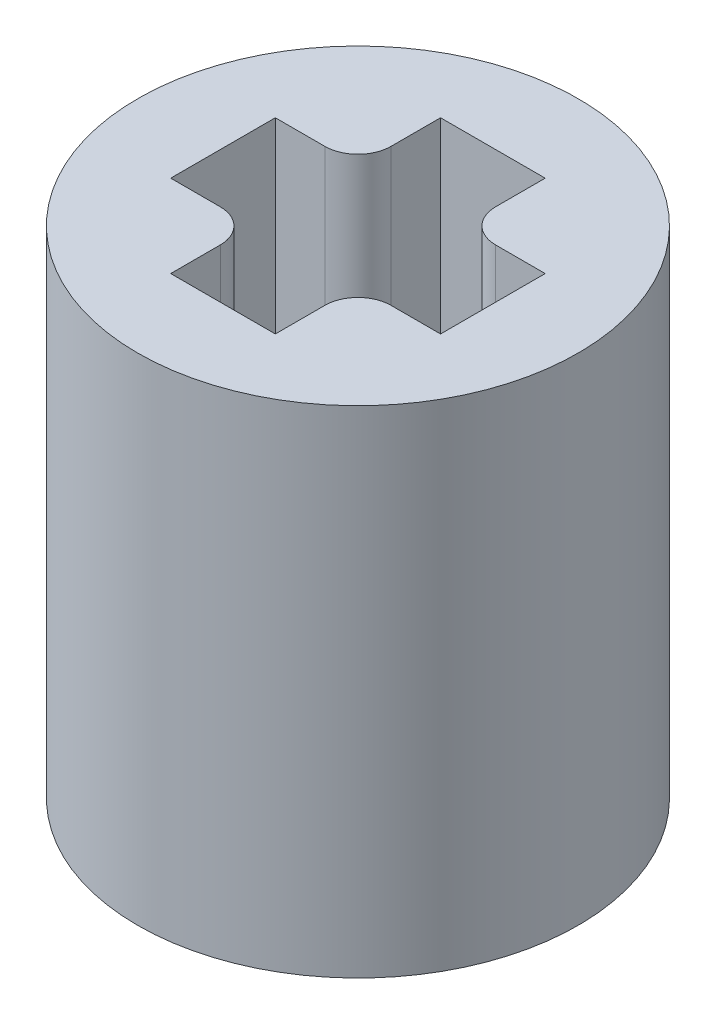
ISO-10303-21;
HEADER;
FILE_DESCRIPTION(('STEP AP214'),'2;1');
FILE_NAME('part.step','',(''),(''),'','','');
FILE_SCHEMA(('AUTOMOTIVE_DESIGN { 1 0 10303 214 1 1 1 1 }'));
ENDSEC;
DATA;
#1=APPLICATION_CONTEXT('core data for automotive mechanical design processes');
#2=APPLICATION_PROTOCOL_DEFINITION('international standard','automotive_design',2000,#1);
#3=PRODUCT_CONTEXT('',#1,'mechanical');
#4=PRODUCT('Part','Part','',(#3));
#5=PRODUCT_RELATED_PRODUCT_CATEGORY('part','',(#4));
#6=PRODUCT_DEFINITION_FORMATION('','',#4);
#7=PRODUCT_DEFINITION_CONTEXT('part definition',#1,'design');
#8=PRODUCT_DEFINITION('design','',#6,#7);
#9=PRODUCT_DEFINITION_SHAPE('','',#8);
#10=(LENGTH_UNIT() NAMED_UNIT(*) SI_UNIT(.MILLI.,.METRE.));
#11=(NAMED_UNIT(*) PLANE_ANGLE_UNIT() SI_UNIT($,.RADIAN.));
#12=(NAMED_UNIT(*) SI_UNIT($,.STERADIAN.) SOLID_ANGLE_UNIT());
#13=UNCERTAINTY_MEASURE_WITH_UNIT(LENGTH_MEASURE(1.E-05),#10,'distance_accuracy_value','');
#14=(GEOMETRIC_REPRESENTATION_CONTEXT(3) GLOBAL_UNCERTAINTY_ASSIGNED_CONTEXT((#13)) GLOBAL_UNIT_ASSIGNED_CONTEXT((#10,
#11,#12)) REPRESENTATION_CONTEXT('',''));
#15=CARTESIAN_POINT('',(0.,0.,0.));
#16=DIRECTION('',(0.,0.,1.));
#17=DIRECTION('',(1.,0.,0.));
#18=AXIS2_PLACEMENT_3D('',#15,#16,#17);
#19=CARTESIAN_POINT('',(0.,0.,0.));
#20=DIRECTION('',(0.,1.,0.));
#21=DIRECTION('',(0.,0.,1.));
#22=AXIS2_PLACEMENT_3D('',#19,#20,#21);
#23=PLANE('',#22);
#24=CARTESIAN_POINT('',(0.,0.,0.));
#25=DIRECTION('',(0.,1.,0.));
#26=DIRECTION('',(0.,0.,1.));
#27=AXIS2_PLACEMENT_3D('',#24,#25,#26);
#28=CIRCLE('',#27,4.);
#29=CARTESIAN_POINT('',(0.,0.,4.));
#30=VERTEX_POINT('',#29);
#31=EDGE_CURVE('E248',#30,#30,#28,.T.);
#32=ORIENTED_EDGE('',*,*,#31,.F.);
#33=EDGE_LOOP('',(#32));
#34=FACE_BOUND('',#33,.T.);
#35=CARTESIAN_POINT('',(0.,0.,0.));
#36=DIRECTION('',(0.,1.,0.));
#37=DIRECTION('',(0.,0.,1.));
#38=AXIS2_PLACEMENT_3D('',#35,#36,#37);
#39=CIRCLE('',#38,2.5);
#40=CARTESIAN_POINT('',(0.,0.,2.5));
#41=VERTEX_POINT('',#40);
#42=EDGE_CURVE('E245',#41,#41,#39,.T.);
#43=ORIENTED_EDGE('',*,*,#42,.T.);
#44=EDGE_LOOP('',(#43));
#45=FACE_BOUND('',#44,.T.);
#46=ADVANCED_FACE('F33',(#34,#45),#23,.F.);
#47=CARTESIAN_POINT('',(0.,4.,0.));
#48=DIRECTION('',(0.,-1.,0.));
#49=DIRECTION('',(0.,0.,-1.));
#50=AXIS2_PLACEMENT_3D('',#47,#48,#49);
#51=CYLINDRICAL_SURFACE('',#50,4.);
#52=ORIENTED_EDGE('',*,*,#31,.T.);
#53=EDGE_LOOP('',(#52));
#54=FACE_BOUND('',#53,.T.);
#55=CARTESIAN_POINT('',(0.,9.,0.));
#56=DIRECTION('',(0.,1.,0.));
#57=DIRECTION('',(0.,0.,1.));
#58=AXIS2_PLACEMENT_3D('',#55,#56,#57);
#59=CIRCLE('',#58,4.);
#60=CARTESIAN_POINT('',(0.,9.,4.));
#61=VERTEX_POINT('',#60);
#62=EDGE_CURVE('E224',#61,#61,#59,.T.);
#63=ORIENTED_EDGE('',*,*,#62,.F.);
#64=EDGE_LOOP('',(#63));
#65=FACE_BOUND('',#64,.T.);
#66=ADVANCED_FACE('F323',(#54,#65),#51,.T.);
#67=CARTESIAN_POINT('',(0.,4.,0.));
#68=DIRECTION('',(0.,-1.,0.));
#69=DIRECTION('',(0.,0.,-1.));
#70=AXIS2_PLACEMENT_3D('',#67,#68,#69);
#71=CYLINDRICAL_SURFACE('',#70,2.5);
#72=CARTESIAN_POINT('',(0.,4.,0.));
#73=DIRECTION('',(0.,1.,0.));
#74=DIRECTION('',(0.,0.,1.));
#75=AXIS2_PLACEMENT_3D('',#72,#73,#74);
#76=CIRCLE('',#75,2.5);
#77=CARTESIAN_POINT('',(0.,4.,2.5));
#78=VERTEX_POINT('',#77);
#79=EDGE_CURVE('E242',#78,#78,#76,.T.);
#80=ORIENTED_EDGE('',*,*,#79,.T.);
#81=EDGE_LOOP('',(#80));
#82=FACE_BOUND('',#81,.T.);
#83=ORIENTED_EDGE('',*,*,#42,.F.);
#84=EDGE_LOOP('',(#83));
#85=FACE_BOUND('',#84,.T.);
#86=ADVANCED_FACE('F329',(#82,#85),#71,.F.);
#87=CARTESIAN_POINT('',(0.,4.,0.));
#88=DIRECTION('',(0.,1.,0.));
#89=DIRECTION('',(0.,0.,1.));
#90=AXIS2_PLACEMENT_3D('',#87,#88,#89);
#91=PLANE('',#90);
#92=ORIENTED_EDGE('',*,*,#79,.F.);
#93=EDGE_LOOP('',(#92));
#94=FACE_BOUND('',#93,.T.);
#95=ADVANCED_FACE('F336',(#94),#91,.F.);
#96=CARTESIAN_POINT('',(0.,9.,0.));
#97=DIRECTION('',(0.,1.,0.));
#98=DIRECTION('',(0.,0.,1.));
#99=AXIS2_PLACEMENT_3D('',#96,#97,#98);
#100=PLANE('',#99);
#101=DIRECTION('',(0.,0.,1.));
#102=VECTOR('',#101,1.);
#103=CARTESIAN_POINT('',(-0.95,9.,0.));
#104=LINE('',#103,#102);
#105=CARTESIAN_POINT('',(-0.95,9.,1.55));
#106=VERTEX_POINT('',#105);
#107=CARTESIAN_POINT('',(-0.95,9.,2.45));
#108=VERTEX_POINT('',#107);
#109=EDGE_CURVE('E200',#106,#108,#104,.T.);
#110=ORIENTED_EDGE('',*,*,#109,.F.);
#111=CARTESIAN_POINT('',(-1.55,9.,1.55));
#112=DIRECTION('',(0.,1.,0.));
#113=DIRECTION('',(0.,0.,1.));
#114=AXIS2_PLACEMENT_3D('',#111,#112,#113);
#115=CIRCLE('',#114,0.6);
#116=CARTESIAN_POINT('',(-1.55,9.,0.95));
#117=VERTEX_POINT('',#116);
#118=EDGE_CURVE('E260',#106,#117,#115,.T.);
#119=ORIENTED_EDGE('',*,*,#118,.T.);
#120=DIRECTION('',(1.,0.,0.));
#121=VECTOR('',#120,1.);
#122=CARTESIAN_POINT('',(0.,9.,0.95));
#123=LINE('',#122,#121);
#124=CARTESIAN_POINT('',(-2.45,9.,0.95));
#125=VERTEX_POINT('',#124);
#126=EDGE_CURVE('E198',#125,#117,#123,.T.);
#127=ORIENTED_EDGE('',*,*,#126,.F.);
#128=DIRECTION('',(0.,0.,1.));
#129=VECTOR('',#128,1.);
#130=CARTESIAN_POINT('',(-2.45,9.,0.));
#131=LINE('',#130,#129);
#132=CARTESIAN_POINT('',(-2.45,9.,-0.95));
#133=VERTEX_POINT('',#132);
#134=EDGE_CURVE('E152',#133,#125,#131,.T.);
#135=ORIENTED_EDGE('',*,*,#134,.F.);
#136=DIRECTION('',(1.,0.,0.));
#137=VECTOR('',#136,1.);
#138=CARTESIAN_POINT('',(0.,9.,-0.95));
#139=LINE('',#138,#137);
#140=CARTESIAN_POINT('',(-1.55,9.,-0.95));
#141=VERTEX_POINT('',#140);
#142=EDGE_CURVE('E170',#133,#141,#139,.T.);
#143=ORIENTED_EDGE('',*,*,#142,.T.);
#144=CARTESIAN_POINT('',(-1.55,9.,-1.55));
#145=DIRECTION('',(0.,1.,0.));
#146=DIRECTION('',(0.,0.,1.));
#147=AXIS2_PLACEMENT_3D('',#144,#145,#146);
#148=CIRCLE('',#147,0.6);
#149=CARTESIAN_POINT('',(-0.95,9.,-1.55));
#150=VERTEX_POINT('',#149);
#151=EDGE_CURVE('E258',#141,#150,#148,.T.);
#152=ORIENTED_EDGE('',*,*,#151,.T.);
#153=DIRECTION('',(0.,0.,1.));
#154=VECTOR('',#153,1.);
#155=CARTESIAN_POINT('',(-0.95,9.,0.));
#156=LINE('',#155,#154);
#157=CARTESIAN_POINT('',(-0.950000000000001,9.,-2.45));
#158=VERTEX_POINT('',#157);
#159=EDGE_CURVE('E173',#158,#150,#156,.T.);
#160=ORIENTED_EDGE('',*,*,#159,.F.);
#161=DIRECTION('',(1.,0.,0.));
#162=VECTOR('',#161,1.);
#163=CARTESIAN_POINT('',(0.,9.,-2.45));
#164=LINE('',#163,#162);
#165=CARTESIAN_POINT('',(0.95,9.,-2.45));
#166=VERTEX_POINT('',#165);
#167=EDGE_CURVE('E217',#158,#166,#164,.T.);
#168=ORIENTED_EDGE('',*,*,#167,.T.);
#169=DIRECTION('',(0.,0.,1.));
#170=VECTOR('',#169,1.);
#171=CARTESIAN_POINT('',(0.95,9.,0.));
#172=LINE('',#171,#170);
#173=CARTESIAN_POINT('',(0.95,9.,-1.55));
#174=VERTEX_POINT('',#173);
#175=EDGE_CURVE('E214',#166,#174,#172,.T.);
#176=ORIENTED_EDGE('',*,*,#175,.T.);
#177=CARTESIAN_POINT('',(1.55,9.,-1.55));
#178=DIRECTION('',(0.,1.,0.));
#179=DIRECTION('',(0.,0.,1.));
#180=AXIS2_PLACEMENT_3D('',#177,#178,#179);
#181=CIRCLE('',#180,0.6);
#182=CARTESIAN_POINT('',(1.55,9.,-0.95));
#183=VERTEX_POINT('',#182);
#184=EDGE_CURVE('E254',#174,#183,#181,.T.);
#185=ORIENTED_EDGE('',*,*,#184,.T.);
#186=DIRECTION('',(1.,0.,0.));
#187=VECTOR('',#186,1.);
#188=CARTESIAN_POINT('',(0.,9.,-0.95));
#189=LINE('',#188,#187);
#190=CARTESIAN_POINT('',(2.45,9.,-0.95));
#191=VERTEX_POINT('',#190);
#192=EDGE_CURVE('E212',#183,#191,#189,.T.);
#193=ORIENTED_EDGE('',*,*,#192,.T.);
#194=DIRECTION('',(0.,0.,1.));
#195=VECTOR('',#194,1.);
#196=CARTESIAN_POINT('',(2.45,9.,0.));
#197=LINE('',#196,#195);
#198=CARTESIAN_POINT('',(2.45,9.,0.95));
#199=VERTEX_POINT('',#198);
#200=EDGE_CURVE('E209',#191,#199,#197,.T.);
#201=ORIENTED_EDGE('',*,*,#200,.T.);
#202=DIRECTION('',(1.,0.,0.));
#203=VECTOR('',#202,1.);
#204=CARTESIAN_POINT('',(0.,9.,0.95));
#205=LINE('',#204,#203);
#206=CARTESIAN_POINT('',(1.55,9.,0.95));
#207=VERTEX_POINT('',#206);
#208=EDGE_CURVE('E207',#207,#199,#205,.T.);
#209=ORIENTED_EDGE('',*,*,#208,.F.);
#210=CARTESIAN_POINT('',(1.55,9.,1.55));
#211=DIRECTION('',(0.,1.,0.));
#212=DIRECTION('',(0.,0.,1.));
#213=AXIS2_PLACEMENT_3D('',#210,#211,#212);
#214=CIRCLE('',#213,0.6);
#215=CARTESIAN_POINT('',(0.95,9.,1.55));
#216=VERTEX_POINT('',#215);
#217=EDGE_CURVE('E256',#207,#216,#214,.T.);
#218=ORIENTED_EDGE('',*,*,#217,.T.);
#219=DIRECTION('',(0.,0.,1.));
#220=VECTOR('',#219,1.);
#221=CARTESIAN_POINT('',(0.95,9.,0.));
#222=LINE('',#221,#220);
#223=CARTESIAN_POINT('',(0.95,9.,2.45));
#224=VERTEX_POINT('',#223);
#225=EDGE_CURVE('E205',#216,#224,#222,.T.);
#226=ORIENTED_EDGE('',*,*,#225,.T.);
#227=DIRECTION('',(1.,0.,0.));
#228=VECTOR('',#227,1.);
#229=CARTESIAN_POINT('',(0.,9.,2.45));
#230=LINE('',#229,#228);
#231=EDGE_CURVE('E202',#108,#224,#230,.T.);
#232=ORIENTED_EDGE('',*,*,#231,.F.);
#233=EDGE_LOOP('',(#110,#119,#127,#135,#143,#152,#160,#168,#176,#185,#193,#201,#209,#218,#226,#232));
#234=FACE_BOUND('',#233,.T.);
#235=ORIENTED_EDGE('',*,*,#62,.T.);
#236=EDGE_LOOP('',(#235));
#237=FACE_BOUND('',#236,.T.);
#238=ADVANCED_FACE('F295',(#234,#237),#100,.T.);
#239=CARTESIAN_POINT('',(-2.45,5.,0.));
#240=DIRECTION('',(-1.,0.,0.));
#241=DIRECTION('',(0.,0.,1.));
#242=AXIS2_PLACEMENT_3D('',#239,#240,#241);
#243=PLANE('',#242);
#244=ORIENTED_EDGE('',*,*,#134,.T.);
#245=DIRECTION('',(0.,1.,0.));
#246=VECTOR('',#245,1.);
#247=CARTESIAN_POINT('',(-2.45,5.,0.95));
#248=LINE('',#247,#246);
#249=CARTESIAN_POINT('',(-2.45,5.,0.95));
#250=VERTEX_POINT('',#249);
#251=EDGE_CURVE('E146',#250,#125,#248,.T.);
#252=ORIENTED_EDGE('',*,*,#251,.F.);
#253=DIRECTION('',(0.,0.,1.));
#254=VECTOR('',#253,1.);
#255=CARTESIAN_POINT('',(-2.45,5.,0.));
#256=LINE('',#255,#254);
#257=CARTESIAN_POINT('',(-2.45,5.,-0.95));
#258=VERTEX_POINT('',#257);
#259=EDGE_CURVE('E150',#258,#250,#256,.T.);
#260=ORIENTED_EDGE('',*,*,#259,.F.);
#261=DIRECTION('',(0.,1.,0.));
#262=VECTOR('',#261,1.);
#263=CARTESIAN_POINT('',(-2.45,5.,-0.95));
#264=LINE('',#263,#262);
#265=EDGE_CURVE('E222',#258,#133,#264,.T.);
#266=ORIENTED_EDGE('',*,*,#265,.T.);
#267=EDGE_LOOP('',(#244,#252,#260,#266));
#268=FACE_BOUND('',#267,.T.);
#269=ADVANCED_FACE('F148',(#268),#243,.F.);
#270=CARTESIAN_POINT('',(0.,5.,-0.95));
#271=DIRECTION('',(0.,0.,1.));
#272=DIRECTION('',(1.,0.,0.));
#273=AXIS2_PLACEMENT_3D('',#270,#271,#272);
#274=PLANE('',#273);
#275=DIRECTION('',(1.,0.,0.));
#276=VECTOR('',#275,1.);
#277=CARTESIAN_POINT('',(0.,5.,-0.95));
#278=LINE('',#277,#276);
#279=CARTESIAN_POINT('',(-1.55,5.,-0.95));
#280=VERTEX_POINT('',#279);
#281=EDGE_CURVE('E157',#258,#280,#278,.T.);
#282=ORIENTED_EDGE('',*,*,#281,.T.);
#283=DIRECTION('',(0.,1.,0.));
#284=VECTOR('',#283,1.);
#285=CARTESIAN_POINT('',(-1.55,9.,-0.95));
#286=LINE('',#285,#284);
#287=EDGE_CURVE('E263',#280,#141,#286,.T.);
#288=ORIENTED_EDGE('',*,*,#287,.T.);
#289=ORIENTED_EDGE('',*,*,#142,.F.);
#290=ORIENTED_EDGE('',*,*,#265,.F.);
#291=EDGE_LOOP('',(#282,#288,#289,#290));
#292=FACE_BOUND('',#291,.T.);
#293=ADVANCED_FACE('F345',(#292),#274,.T.);
#294=CARTESIAN_POINT('',(-0.95,5.,0.));
#295=DIRECTION('',(-1.,0.,0.));
#296=DIRECTION('',(0.,0.,1.));
#297=AXIS2_PLACEMENT_3D('',#294,#295,#296);
#298=PLANE('',#297);
#299=ORIENTED_EDGE('',*,*,#159,.T.);
#300=DIRECTION('',(0.,1.,0.));
#301=VECTOR('',#300,1.);
#302=CARTESIAN_POINT('',(-0.95,5.,-1.55));
#303=LINE('',#302,#301);
#304=CARTESIAN_POINT('',(-0.95,5.,-1.55));
#305=VERTEX_POINT('',#304);
#306=EDGE_CURVE('E266',#150,#305,#303,.F.);
#307=ORIENTED_EDGE('',*,*,#306,.T.);
#308=DIRECTION('',(0.,0.,1.));
#309=VECTOR('',#308,1.);
#310=CARTESIAN_POINT('',(-0.95,5.,0.));
#311=LINE('',#310,#309);
#312=CARTESIAN_POINT('',(-0.950000000000001,5.,-2.45));
#313=VERTEX_POINT('',#312);
#314=EDGE_CURVE('E193',#313,#305,#311,.T.);
#315=ORIENTED_EDGE('',*,*,#314,.F.);
#316=DIRECTION('',(0.,1.,0.));
#317=VECTOR('',#316,1.);
#318=CARTESIAN_POINT('',(-0.950000000000001,5.,-2.45));
#319=LINE('',#318,#317);
#320=EDGE_CURVE('E225',#313,#158,#319,.T.);
#321=ORIENTED_EDGE('',*,*,#320,.T.);
#322=EDGE_LOOP('',(#299,#307,#315,#321));
#323=FACE_BOUND('',#322,.T.);
#324=ADVANCED_FACE('F370',(#323),#298,.F.);
#325=CARTESIAN_POINT('',(0.,5.,-2.45));
#326=DIRECTION('',(0.,0.,1.));
#327=DIRECTION('',(1.,0.,0.));
#328=AXIS2_PLACEMENT_3D('',#325,#326,#327);
#329=PLANE('',#328);
#330=ORIENTED_EDGE('',*,*,#167,.F.);
#331=ORIENTED_EDGE('',*,*,#320,.F.);
#332=DIRECTION('',(1.,0.,0.));
#333=VECTOR('',#332,1.);
#334=CARTESIAN_POINT('',(0.,5.,-2.45));
#335=LINE('',#334,#333);
#336=CARTESIAN_POINT('',(0.95,5.,-2.45));
#337=VERTEX_POINT('',#336);
#338=EDGE_CURVE('E191',#313,#337,#335,.T.);
#339=ORIENTED_EDGE('',*,*,#338,.T.);
#340=DIRECTION('',(0.,1.,0.));
#341=VECTOR('',#340,1.);
#342=CARTESIAN_POINT('',(0.95,5.,-2.45));
#343=LINE('',#342,#341);
#344=EDGE_CURVE('E227',#337,#166,#343,.T.);
#345=ORIENTED_EDGE('',*,*,#344,.T.);
#346=EDGE_LOOP('',(#330,#331,#339,#345));
#347=FACE_BOUND('',#346,.T.);
#348=ADVANCED_FACE('F366',(#347),#329,.T.);
#349=CARTESIAN_POINT('',(0.95,5.,0.));
#350=DIRECTION('',(-1.,0.,0.));
#351=DIRECTION('',(0.,0.,1.));
#352=AXIS2_PLACEMENT_3D('',#349,#350,#351);
#353=PLANE('',#352);
#354=DIRECTION('',(0.,0.,1.));
#355=VECTOR('',#354,1.);
#356=CARTESIAN_POINT('',(0.95,5.,0.));
#357=LINE('',#356,#355);
#358=CARTESIAN_POINT('',(0.95,5.,-1.55));
#359=VERTEX_POINT('',#358);
#360=EDGE_CURVE('E189',#337,#359,#357,.T.);
#361=ORIENTED_EDGE('',*,*,#360,.T.);
#362=DIRECTION('',(0.,1.,0.));
#363=VECTOR('',#362,1.);
#364=CARTESIAN_POINT('',(0.95,5.,-1.55));
#365=LINE('',#364,#363);
#366=EDGE_CURVE('E273',#359,#174,#365,.T.);
#367=ORIENTED_EDGE('',*,*,#366,.T.);
#368=ORIENTED_EDGE('',*,*,#175,.F.);
#369=ORIENTED_EDGE('',*,*,#344,.F.);
#370=EDGE_LOOP('',(#361,#367,#368,#369));
#371=FACE_BOUND('',#370,.T.);
#372=ADVANCED_FACE('F363',(#371),#353,.T.);
#373=CARTESIAN_POINT('',(0.,5.,-0.95));
#374=DIRECTION('',(0.,0.,1.));
#375=DIRECTION('',(1.,0.,0.));
#376=AXIS2_PLACEMENT_3D('',#373,#374,#375);
#377=PLANE('',#376);
#378=ORIENTED_EDGE('',*,*,#192,.F.);
#379=DIRECTION('',(0.,1.,0.));
#380=VECTOR('',#379,1.);
#381=CARTESIAN_POINT('',(1.55,5.,-0.95));
#382=LINE('',#381,#380);
#383=CARTESIAN_POINT('',(1.55,5.,-0.95));
#384=VERTEX_POINT('',#383);
#385=EDGE_CURVE('E48',#183,#384,#382,.F.);
#386=ORIENTED_EDGE('',*,*,#385,.T.);
#387=DIRECTION('',(1.,0.,0.));
#388=VECTOR('',#387,1.);
#389=CARTESIAN_POINT('',(0.,5.,-0.95));
#390=LINE('',#389,#388);
#391=CARTESIAN_POINT('',(2.45,5.,-0.95));
#392=VERTEX_POINT('',#391);
#393=EDGE_CURVE('E187',#384,#392,#390,.T.);
#394=ORIENTED_EDGE('',*,*,#393,.T.);
#395=DIRECTION('',(0.,1.,0.));
#396=VECTOR('',#395,1.);
#397=CARTESIAN_POINT('',(2.45,5.,-0.95));
#398=LINE('',#397,#396);
#399=EDGE_CURVE('E229',#392,#191,#398,.T.);
#400=ORIENTED_EDGE('',*,*,#399,.T.);
#401=EDGE_LOOP('',(#378,#386,#394,#400));
#402=FACE_BOUND('',#401,.T.);
#403=ADVANCED_FACE('F359',(#402),#377,.T.);
#404=CARTESIAN_POINT('',(2.45,5.,0.));
#405=DIRECTION('',(-1.,0.,0.));
#406=DIRECTION('',(0.,0.,1.));
#407=AXIS2_PLACEMENT_3D('',#404,#405,#406);
#408=PLANE('',#407);
#409=ORIENTED_EDGE('',*,*,#200,.F.);
#410=ORIENTED_EDGE('',*,*,#399,.F.);
#411=DIRECTION('',(0.,0.,1.));
#412=VECTOR('',#411,1.);
#413=CARTESIAN_POINT('',(2.45,5.,0.));
#414=LINE('',#413,#412);
#415=CARTESIAN_POINT('',(2.45,5.,0.95));
#416=VERTEX_POINT('',#415);
#417=EDGE_CURVE('E184',#392,#416,#414,.T.);
#418=ORIENTED_EDGE('',*,*,#417,.T.);
#419=DIRECTION('',(0.,1.,0.));
#420=VECTOR('',#419,1.);
#421=CARTESIAN_POINT('',(2.45,5.,0.95));
#422=LINE('',#421,#420);
#423=EDGE_CURVE('E232',#416,#199,#422,.T.);
#424=ORIENTED_EDGE('',*,*,#423,.T.);
#425=EDGE_LOOP('',(#409,#410,#418,#424));
#426=FACE_BOUND('',#425,.T.);
#427=ADVANCED_FACE('F356',(#426),#408,.T.);
#428=CARTESIAN_POINT('',(0.,5.,0.95));
#429=DIRECTION('',(0.,0.,1.));
#430=DIRECTION('',(1.,0.,0.));
#431=AXIS2_PLACEMENT_3D('',#428,#429,#430);
#432=PLANE('',#431);
#433=DIRECTION('',(1.,0.,0.));
#434=VECTOR('',#433,1.);
#435=CARTESIAN_POINT('',(0.,5.,0.95));
#436=LINE('',#435,#434);
#437=CARTESIAN_POINT('',(1.55,5.,0.95));
#438=VERTEX_POINT('',#437);
#439=EDGE_CURVE('E182',#438,#416,#436,.T.);
#440=ORIENTED_EDGE('',*,*,#439,.F.);
#441=DIRECTION('',(0.,1.,0.));
#442=VECTOR('',#441,1.);
#443=CARTESIAN_POINT('',(1.55,9.,0.95));
#444=LINE('',#443,#442);
#445=EDGE_CURVE('E268',#438,#207,#444,.T.);
#446=ORIENTED_EDGE('',*,*,#445,.T.);
#447=ORIENTED_EDGE('',*,*,#208,.T.);
#448=ORIENTED_EDGE('',*,*,#423,.F.);
#449=EDGE_LOOP('',(#440,#446,#447,#448));
#450=FACE_BOUND('',#449,.T.);
#451=ADVANCED_FACE('F289',(#450),#432,.F.);
#452=CARTESIAN_POINT('',(0.95,5.,0.));
#453=DIRECTION('',(-1.,0.,0.));
#454=DIRECTION('',(0.,0.,1.));
#455=AXIS2_PLACEMENT_3D('',#452,#453,#454);
#456=PLANE('',#455);
#457=ORIENTED_EDGE('',*,*,#225,.F.);
#458=DIRECTION('',(0.,1.,0.));
#459=VECTOR('',#458,1.);
#460=CARTESIAN_POINT('',(0.95,5.,1.55));
#461=LINE('',#460,#459);
#462=CARTESIAN_POINT('',(0.95,5.,1.55));
#463=VERTEX_POINT('',#462);
#464=EDGE_CURVE('E271',#216,#463,#461,.F.);
#465=ORIENTED_EDGE('',*,*,#464,.T.);
#466=DIRECTION('',(0.,0.,1.));
#467=VECTOR('',#466,1.);
#468=CARTESIAN_POINT('',(0.95,5.,0.));
#469=LINE('',#468,#467);
#470=CARTESIAN_POINT('',(0.95,5.,2.45));
#471=VERTEX_POINT('',#470);
#472=EDGE_CURVE('E180',#463,#471,#469,.T.);
#473=ORIENTED_EDGE('',*,*,#472,.T.);
#474=DIRECTION('',(0.,1.,0.));
#475=VECTOR('',#474,1.);
#476=CARTESIAN_POINT('',(0.95,5.,2.45));
#477=LINE('',#476,#475);
#478=EDGE_CURVE('E235',#471,#224,#477,.T.);
#479=ORIENTED_EDGE('',*,*,#478,.T.);
#480=EDGE_LOOP('',(#457,#465,#473,#479));
#481=FACE_BOUND('',#480,.T.);
#482=ADVANCED_FACE('F299',(#481),#456,.T.);
#483=CARTESIAN_POINT('',(0.,5.,2.45));
#484=DIRECTION('',(0.,0.,1.));
#485=DIRECTION('',(1.,0.,0.));
#486=AXIS2_PLACEMENT_3D('',#483,#484,#485);
#487=PLANE('',#486);
#488=ORIENTED_EDGE('',*,*,#231,.T.);
#489=ORIENTED_EDGE('',*,*,#478,.F.);
#490=DIRECTION('',(1.,0.,0.));
#491=VECTOR('',#490,1.);
#492=CARTESIAN_POINT('',(0.,5.,2.45));
#493=LINE('',#492,#491);
#494=CARTESIAN_POINT('',(-0.95,5.,2.45));
#495=VERTEX_POINT('',#494);
#496=EDGE_CURVE('E177',#495,#471,#493,.T.);
#497=ORIENTED_EDGE('',*,*,#496,.F.);
#498=DIRECTION('',(0.,1.,0.));
#499=VECTOR('',#498,1.);
#500=CARTESIAN_POINT('',(-0.95,5.,2.45));
#501=LINE('',#500,#499);
#502=EDGE_CURVE('E156',#495,#108,#501,.T.);
#503=ORIENTED_EDGE('',*,*,#502,.T.);
#504=EDGE_LOOP('',(#488,#489,#497,#503));
#505=FACE_BOUND('',#504,.T.);
#506=ADVANCED_FACE('F303',(#505),#487,.F.);
#507=CARTESIAN_POINT('',(-0.95,5.,0.));
#508=DIRECTION('',(-1.,0.,0.));
#509=DIRECTION('',(0.,0.,1.));
#510=AXIS2_PLACEMENT_3D('',#507,#508,#509);
#511=PLANE('',#510);
#512=DIRECTION('',(0.,0.,1.));
#513=VECTOR('',#512,1.);
#514=CARTESIAN_POINT('',(-0.95,5.,0.));
#515=LINE('',#514,#513);
#516=CARTESIAN_POINT('',(-0.95,5.,1.55));
#517=VERTEX_POINT('',#516);
#518=EDGE_CURVE('E165',#517,#495,#515,.T.);
#519=ORIENTED_EDGE('',*,*,#518,.F.);
#520=DIRECTION('',(0.,1.,0.));
#521=VECTOR('',#520,1.);
#522=CARTESIAN_POINT('',(-0.95,5.,1.55));
#523=LINE('',#522,#521);
#524=EDGE_CURVE('E251',#517,#106,#523,.T.);
#525=ORIENTED_EDGE('',*,*,#524,.T.);
#526=ORIENTED_EDGE('',*,*,#109,.T.);
#527=ORIENTED_EDGE('',*,*,#502,.F.);
#528=EDGE_LOOP('',(#519,#525,#526,#527));
#529=FACE_BOUND('',#528,.T.);
#530=ADVANCED_FACE('F307',(#529),#511,.F.);
#531=CARTESIAN_POINT('',(0.,5.,0.95));
#532=DIRECTION('',(0.,0.,1.));
#533=DIRECTION('',(1.,0.,0.));
#534=AXIS2_PLACEMENT_3D('',#531,#532,#533);
#535=PLANE('',#534);
#536=ORIENTED_EDGE('',*,*,#126,.T.);
#537=DIRECTION('',(0.,1.,0.));
#538=VECTOR('',#537,1.);
#539=CARTESIAN_POINT('',(-1.55,5.,0.95));
#540=LINE('',#539,#538);
#541=CARTESIAN_POINT('',(-1.55,5.,0.95));
#542=VERTEX_POINT('',#541);
#543=EDGE_CURVE('E163',#117,#542,#540,.F.);
#544=ORIENTED_EDGE('',*,*,#543,.T.);
#545=DIRECTION('',(1.,0.,0.));
#546=VECTOR('',#545,1.);
#547=CARTESIAN_POINT('',(0.,5.,0.95));
#548=LINE('',#547,#546);
#549=EDGE_CURVE('E160',#250,#542,#548,.T.);
#550=ORIENTED_EDGE('',*,*,#549,.F.);
#551=ORIENTED_EDGE('',*,*,#251,.T.);
#552=EDGE_LOOP('',(#536,#544,#550,#551));
#553=FACE_BOUND('',#552,.T.);
#554=ADVANCED_FACE('F161',(#553),#535,.F.);
#555=CARTESIAN_POINT('',(0.,5.,0.));
#556=DIRECTION('',(0.,1.,0.));
#557=DIRECTION('',(0.,0.,1.));
#558=AXIS2_PLACEMENT_3D('',#555,#556,#557);
#559=PLANE('',#558);
#560=ORIENTED_EDGE('',*,*,#259,.T.);
#561=ORIENTED_EDGE('',*,*,#549,.T.);
#562=CARTESIAN_POINT('',(-1.55,5.,1.55));
#563=DIRECTION('',(0.,1.,0.));
#564=DIRECTION('',(0.,0.,1.));
#565=AXIS2_PLACEMENT_3D('',#562,#563,#564);
#566=CIRCLE('',#565,0.6);
#567=EDGE_CURVE('E277',#542,#517,#566,.F.);
#568=ORIENTED_EDGE('',*,*,#567,.T.);
#569=ORIENTED_EDGE('',*,*,#518,.T.);
#570=ORIENTED_EDGE('',*,*,#496,.T.);
#571=ORIENTED_EDGE('',*,*,#472,.F.);
#572=CARTESIAN_POINT('',(1.55,5.,1.55));
#573=DIRECTION('',(0.,1.,0.));
#574=DIRECTION('',(0.,0.,1.));
#575=AXIS2_PLACEMENT_3D('',#572,#573,#574);
#576=CIRCLE('',#575,0.6);
#577=EDGE_CURVE('E41',#463,#438,#576,.F.);
#578=ORIENTED_EDGE('',*,*,#577,.T.);
#579=ORIENTED_EDGE('',*,*,#439,.T.);
#580=ORIENTED_EDGE('',*,*,#417,.F.);
#581=ORIENTED_EDGE('',*,*,#393,.F.);
#582=CARTESIAN_POINT('',(1.55,5.,-1.55));
#583=DIRECTION('',(0.,1.,0.));
#584=DIRECTION('',(0.,0.,1.));
#585=AXIS2_PLACEMENT_3D('',#582,#583,#584);
#586=CIRCLE('',#585,0.6);
#587=EDGE_CURVE('E11',#384,#359,#586,.F.);
#588=ORIENTED_EDGE('',*,*,#587,.T.);
#589=ORIENTED_EDGE('',*,*,#360,.F.);
#590=ORIENTED_EDGE('',*,*,#338,.F.);
#591=ORIENTED_EDGE('',*,*,#314,.T.);
#592=CARTESIAN_POINT('',(-1.55,5.,-1.55));
#593=DIRECTION('',(0.,1.,0.));
#594=DIRECTION('',(0.,0.,1.));
#595=AXIS2_PLACEMENT_3D('',#592,#593,#594);
#596=CIRCLE('',#595,0.6);
#597=EDGE_CURVE('E279',#305,#280,#596,.F.);
#598=ORIENTED_EDGE('',*,*,#597,.T.);
#599=ORIENTED_EDGE('',*,*,#281,.F.);
#600=EDGE_LOOP('',(#560,#561,#568,#569,#570,#571,#578,#579,#580,#581,#588,#589,#590,#591,#598,#599));
#601=FACE_BOUND('',#600,.T.);
#602=ADVANCED_FACE('F168',(#601),#559,.T.);
#603=CARTESIAN_POINT('',(-1.55,5.,1.55));
#604=DIRECTION('',(0.,1.,0.));
#605=DIRECTION('',(0.,0.,1.));
#606=AXIS2_PLACEMENT_3D('',#603,#604,#605);
#607=CYLINDRICAL_SURFACE('',#606,0.6);
#608=ORIENTED_EDGE('',*,*,#567,.F.);
#609=ORIENTED_EDGE('',*,*,#543,.F.);
#610=ORIENTED_EDGE('',*,*,#118,.F.);
#611=ORIENTED_EDGE('',*,*,#524,.F.);
#612=EDGE_LOOP('',(#608,#609,#610,#611));
#613=FACE_BOUND('',#612,.T.);
#614=ADVANCED_FACE('F310',(#613),#607,.T.);
#615=CARTESIAN_POINT('',(-1.55,5.,-1.55));
#616=DIRECTION('',(0.,-1.,0.));
#617=DIRECTION('',(0.,0.,-1.));
#618=AXIS2_PLACEMENT_3D('',#615,#616,#617);
#619=CYLINDRICAL_SURFACE('',#618,0.6);
#620=ORIENTED_EDGE('',*,*,#597,.F.);
#621=ORIENTED_EDGE('',*,*,#306,.F.);
#622=ORIENTED_EDGE('',*,*,#151,.F.);
#623=ORIENTED_EDGE('',*,*,#287,.F.);
#624=EDGE_LOOP('',(#620,#621,#622,#623));
#625=FACE_BOUND('',#624,.T.);
#626=ADVANCED_FACE('F312',(#625),#619,.T.);
#627=CARTESIAN_POINT('',(1.55,5.,1.55));
#628=DIRECTION('',(0.,-1.,0.));
#629=DIRECTION('',(0.,0.,-1.));
#630=AXIS2_PLACEMENT_3D('',#627,#628,#629);
#631=CYLINDRICAL_SURFACE('',#630,0.6);
#632=ORIENTED_EDGE('',*,*,#577,.F.);
#633=ORIENTED_EDGE('',*,*,#464,.F.);
#634=ORIENTED_EDGE('',*,*,#217,.F.);
#635=ORIENTED_EDGE('',*,*,#445,.F.);
#636=EDGE_LOOP('',(#632,#633,#634,#635));
#637=FACE_BOUND('',#636,.T.);
#638=ADVANCED_FACE('F291',(#637),#631,.T.);
#639=CARTESIAN_POINT('',(1.55,5.,-1.55));
#640=DIRECTION('',(0.,1.,0.));
#641=DIRECTION('',(0.,0.,1.));
#642=AXIS2_PLACEMENT_3D('',#639,#640,#641);
#643=CYLINDRICAL_SURFACE('',#642,0.6);
#644=ORIENTED_EDGE('',*,*,#587,.F.);
#645=ORIENTED_EDGE('',*,*,#385,.F.);
#646=ORIENTED_EDGE('',*,*,#184,.F.);
#647=ORIENTED_EDGE('',*,*,#366,.F.);
#648=EDGE_LOOP('',(#644,#645,#646,#647));
#649=FACE_BOUND('',#648,.T.);
#650=ADVANCED_FACE('F35',(#649),#643,.T.);
#651=CLOSED_SHELL('',(#46,#66,#86,#95,#238,#269,#293,#324,#348,#372,#403,#427,#451,#482,#506,
#530,#554,#602,#614,#626,#638,#650));
#652=MANIFOLD_SOLID_BREP('B2',#651);
#653=ADVANCED_BREP_SHAPE_REPRESENTATION('',(#18,#652),#14);
#654=SHAPE_DEFINITION_REPRESENTATION(#9,#653);
ENDSEC;
END-ISO-10303-21;
